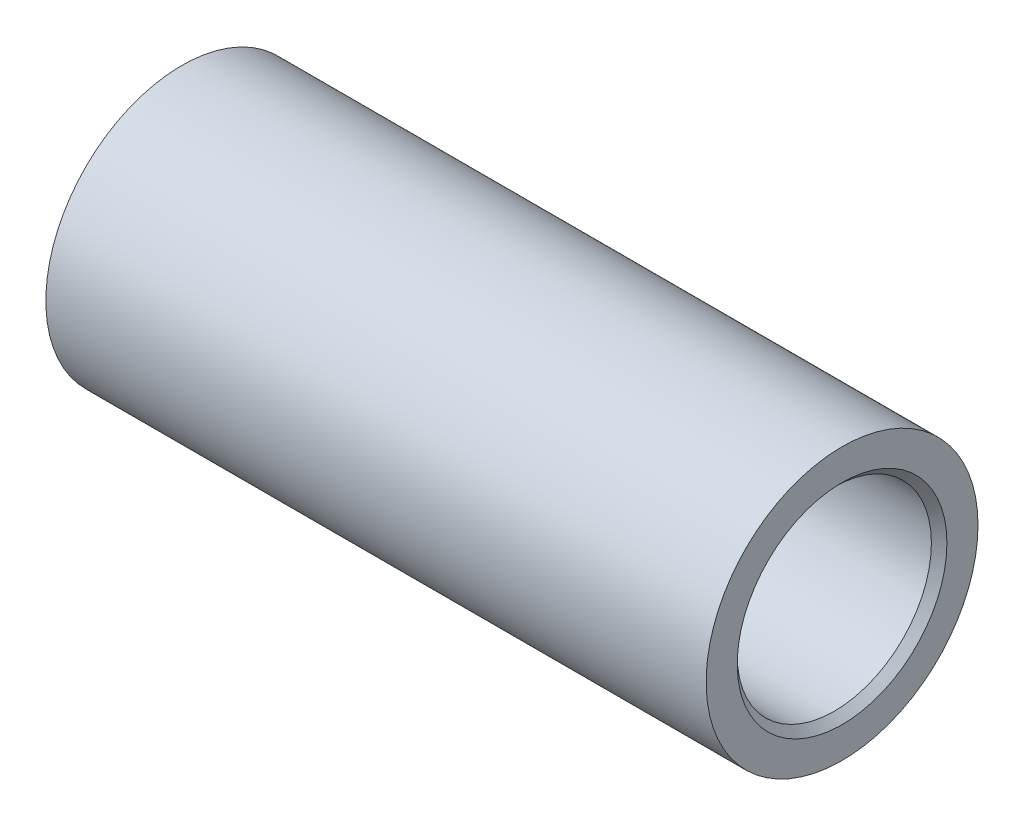
ISO-10303-21;
HEADER;
FILE_DESCRIPTION(('STEP AP214'),'2;1');
FILE_NAME('part.step','',(''),(''),'','','');
FILE_SCHEMA(('AUTOMOTIVE_DESIGN { 1 0 10303 214 1 1 1 1 }'));
ENDSEC;
DATA;
#1=APPLICATION_CONTEXT('core data for automotive mechanical design processes');
#2=APPLICATION_PROTOCOL_DEFINITION('international standard','automotive_design',2000,#1);
#3=PRODUCT_CONTEXT('',#1,'mechanical');
#4=PRODUCT('Part','Part','',(#3));
#5=PRODUCT_RELATED_PRODUCT_CATEGORY('part','',(#4));
#6=PRODUCT_DEFINITION_FORMATION('','',#4);
#7=PRODUCT_DEFINITION_CONTEXT('part definition',#1,'design');
#8=PRODUCT_DEFINITION('design','',#6,#7);
#9=PRODUCT_DEFINITION_SHAPE('','',#8);
#10=(LENGTH_UNIT() NAMED_UNIT(*) SI_UNIT(.MILLI.,.METRE.));
#11=(NAMED_UNIT(*) PLANE_ANGLE_UNIT() SI_UNIT($,.RADIAN.));
#12=(NAMED_UNIT(*) SI_UNIT($,.STERADIAN.) SOLID_ANGLE_UNIT());
#13=UNCERTAINTY_MEASURE_WITH_UNIT(LENGTH_MEASURE(1.E-05),#10,'distance_accuracy_value','');
#14=(GEOMETRIC_REPRESENTATION_CONTEXT(3) GLOBAL_UNCERTAINTY_ASSIGNED_CONTEXT((#13)) GLOBAL_UNIT_ASSIGNED_CONTEXT((#10,
#11,#12)) REPRESENTATION_CONTEXT('',''));
#15=CARTESIAN_POINT('',(0.,0.,0.));
#16=DIRECTION('',(0.,0.,1.));
#17=DIRECTION('',(1.,0.,0.));
#18=AXIS2_PLACEMENT_3D('',#15,#16,#17);
#19=CARTESIAN_POINT('',(85.,0.,0.));
#20=DIRECTION('',(1.,0.,0.));
#21=DIRECTION('',(0.,0.,-1.));
#22=AXIS2_PLACEMENT_3D('',#19,#20,#21);
#23=PLANE('',#22);
#24=CARTESIAN_POINT('',(85.,0.,0.));
#25=DIRECTION('',(1.,0.,0.));
#26=DIRECTION('',(0.,0.,-1.));
#27=AXIS2_PLACEMENT_3D('',#24,#25,#26);
#28=CIRCLE('',#27,13.5);
#29=CARTESIAN_POINT('',(85.,0.,-13.5));
#30=VERTEX_POINT('',#29);
#31=EDGE_CURVE('E10',#30,#30,#28,.F.);
#32=ORIENTED_EDGE('',*,*,#31,.T.);
#33=EDGE_LOOP('',(#32));
#34=FACE_BOUND('',#33,.T.);
#35=CARTESIAN_POINT('',(85.,0.,0.));
#36=DIRECTION('',(1.,0.,0.));
#37=DIRECTION('',(0.,0.,-1.));
#38=AXIS2_PLACEMENT_3D('',#35,#36,#37);
#39=CIRCLE('',#38,17.5);
#40=CARTESIAN_POINT('',(85.,0.,-17.5));
#41=VERTEX_POINT('',#40);
#42=EDGE_CURVE('E51',#41,#41,#39,.T.);
#43=ORIENTED_EDGE('',*,*,#42,.T.);
#44=EDGE_LOOP('',(#43));
#45=FACE_BOUND('',#44,.T.);
#46=ADVANCED_FACE('F31',(#34,#45),#23,.T.);
#47=CARTESIAN_POINT('',(0.,0.,0.));
#48=DIRECTION('',(1.,0.,0.));
#49=DIRECTION('',(0.,0.,-1.));
#50=AXIS2_PLACEMENT_3D('',#47,#48,#49);
#51=PLANE('',#50);
#52=CARTESIAN_POINT('',(0.,0.,0.));
#53=DIRECTION('',(1.,0.,0.));
#54=DIRECTION('',(0.,0.,-1.));
#55=AXIS2_PLACEMENT_3D('',#52,#53,#54);
#56=CIRCLE('',#55,13.5);
#57=CARTESIAN_POINT('',(0.,0.,-13.5));
#58=VERTEX_POINT('',#57);
#59=EDGE_CURVE('E46',#58,#58,#56,.T.);
#60=ORIENTED_EDGE('',*,*,#59,.T.);
#61=EDGE_LOOP('',(#60));
#62=FACE_BOUND('',#61,.T.);
#63=CARTESIAN_POINT('',(0.,0.,0.));
#64=DIRECTION('',(1.,0.,0.));
#65=DIRECTION('',(0.,0.,-1.));
#66=AXIS2_PLACEMENT_3D('',#63,#64,#65);
#67=CIRCLE('',#66,17.5);
#68=CARTESIAN_POINT('',(0.,0.,-17.5));
#69=VERTEX_POINT('',#68);
#70=EDGE_CURVE('E52',#69,#69,#67,.T.);
#71=ORIENTED_EDGE('',*,*,#70,.F.);
#72=EDGE_LOOP('',(#71));
#73=FACE_BOUND('',#72,.T.);
#74=ADVANCED_FACE('F63',(#62,#73),#51,.F.);
#75=CARTESIAN_POINT('',(85.,0.,0.));
#76=DIRECTION('',(-1.,0.,0.));
#77=DIRECTION('',(0.,0.,1.));
#78=AXIS2_PLACEMENT_3D('',#75,#76,#77);
#79=CYLINDRICAL_SURFACE('',#78,17.5);
#80=ORIENTED_EDGE('',*,*,#42,.F.);
#81=EDGE_LOOP('',(#80));
#82=FACE_BOUND('',#81,.T.);
#83=ORIENTED_EDGE('',*,*,#70,.T.);
#84=EDGE_LOOP('',(#83));
#85=FACE_BOUND('',#84,.T.);
#86=ADVANCED_FACE('F59',(#82,#85),#79,.T.);
#87=CARTESIAN_POINT('',(85.,0.,0.));
#88=DIRECTION('',(-1.,0.,0.));
#89=DIRECTION('',(0.,0.,1.));
#90=AXIS2_PLACEMENT_3D('',#87,#88,#89);
#91=CYLINDRICAL_SURFACE('',#90,12.5);
#92=CARTESIAN_POINT('',(1.00000000000001,0.,0.));
#93=DIRECTION('',(1.,0.,0.));
#94=DIRECTION('',(0.,0.,-1.));
#95=AXIS2_PLACEMENT_3D('',#92,#93,#94);
#96=CIRCLE('',#95,12.5);
#97=CARTESIAN_POINT('',(1.00000000000001,0.,-12.5));
#98=VERTEX_POINT('',#97);
#99=EDGE_CURVE('E38',#98,#98,#96,.F.);
#100=ORIENTED_EDGE('',*,*,#99,.T.);
#101=EDGE_LOOP('',(#100));
#102=FACE_BOUND('',#101,.T.);
#103=CARTESIAN_POINT('',(84.,0.,0.));
#104=DIRECTION('',(1.,0.,0.));
#105=DIRECTION('',(0.,0.,-1.));
#106=AXIS2_PLACEMENT_3D('',#103,#104,#105);
#107=CIRCLE('',#106,12.5);
#108=CARTESIAN_POINT('',(84.,0.,-12.5));
#109=VERTEX_POINT('',#108);
#110=EDGE_CURVE('E42',#109,#109,#107,.T.);
#111=ORIENTED_EDGE('',*,*,#110,.T.);
#112=EDGE_LOOP('',(#111));
#113=FACE_BOUND('',#112,.T.);
#114=ADVANCED_FACE('F62',(#102,#113),#91,.F.);
#115=CARTESIAN_POINT('',(0.,0.,0.));
#116=DIRECTION('',(-1.,0.,0.));
#117=DIRECTION('',(0.,0.,1.));
#118=AXIS2_PLACEMENT_3D('',#115,#116,#117);
#119=CONICAL_SURFACE('',#118,13.5,0.785398163397453);
#120=ORIENTED_EDGE('',*,*,#99,.F.);
#121=EDGE_LOOP('',(#120));
#122=FACE_BOUND('',#121,.T.);
#123=ORIENTED_EDGE('',*,*,#59,.F.);
#124=EDGE_LOOP('',(#123));
#125=FACE_BOUND('',#124,.T.);
#126=ADVANCED_FACE('F75',(#122,#125),#119,.F.);
#127=CARTESIAN_POINT('',(84.,0.,0.));
#128=DIRECTION('',(1.,0.,0.));
#129=DIRECTION('',(0.,0.,-1.));
#130=AXIS2_PLACEMENT_3D('',#127,#128,#129);
#131=CONICAL_SURFACE('',#130,12.5,0.785398163397447);
#132=ORIENTED_EDGE('',*,*,#31,.F.);
#133=EDGE_LOOP('',(#132));
#134=FACE_BOUND('',#133,.T.);
#135=ORIENTED_EDGE('',*,*,#110,.F.);
#136=EDGE_LOOP('',(#135));
#137=FACE_BOUND('',#136,.T.);
#138=ADVANCED_FACE('F33',(#134,#137),#131,.F.);
#139=CLOSED_SHELL('',(#46,#74,#86,#114,#126,#138));
#140=MANIFOLD_SOLID_BREP('B2',#139);
#141=ADVANCED_BREP_SHAPE_REPRESENTATION('',(#18,#140),#14);
#142=SHAPE_DEFINITION_REPRESENTATION(#9,#141);
ENDSEC;
END-ISO-10303-21;
